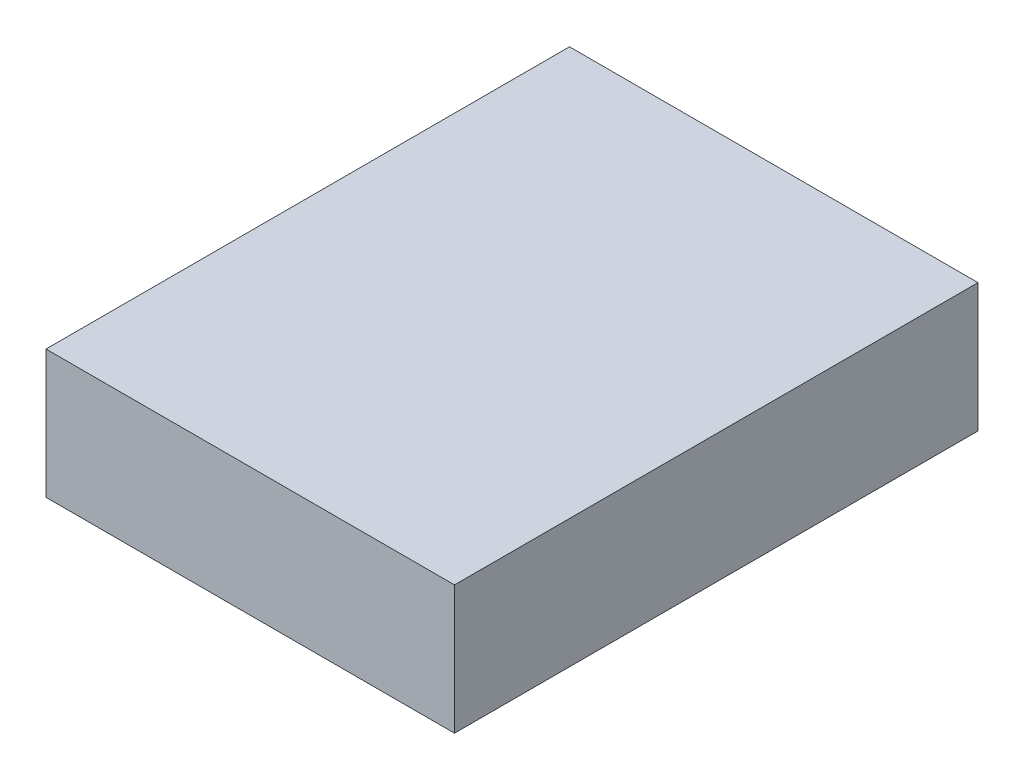
ISO-10303-21;
HEADER;
FILE_DESCRIPTION(('STEP AP214'),'2;1');
FILE_NAME('part.step','',(''),(''),'','','');
FILE_SCHEMA(('AUTOMOTIVE_DESIGN { 1 0 10303 214 1 1 1 1 }'));
ENDSEC;
DATA;
#1=APPLICATION_CONTEXT('core data for automotive mechanical design processes');
#2=APPLICATION_PROTOCOL_DEFINITION('international standard','automotive_design',2000,#1);
#3=PRODUCT_CONTEXT('',#1,'mechanical');
#4=PRODUCT('Part','Part','',(#3));
#5=PRODUCT_RELATED_PRODUCT_CATEGORY('part','',(#4));
#6=PRODUCT_DEFINITION_FORMATION('','',#4);
#7=PRODUCT_DEFINITION_CONTEXT('part definition',#1,'design');
#8=PRODUCT_DEFINITION('design','',#6,#7);
#9=PRODUCT_DEFINITION_SHAPE('','',#8);
#10=(LENGTH_UNIT() NAMED_UNIT(*) SI_UNIT(.MILLI.,.METRE.));
#11=(NAMED_UNIT(*) PLANE_ANGLE_UNIT() SI_UNIT($,.RADIAN.));
#12=(NAMED_UNIT(*) SI_UNIT($,.STERADIAN.) SOLID_ANGLE_UNIT());
#13=UNCERTAINTY_MEASURE_WITH_UNIT(LENGTH_MEASURE(1.E-05),#10,'distance_accuracy_value','');
#14=(GEOMETRIC_REPRESENTATION_CONTEXT(3) GLOBAL_UNCERTAINTY_ASSIGNED_CONTEXT((#13)) GLOBAL_UNIT_ASSIGNED_CONTEXT((#10,
#11,#12)) REPRESENTATION_CONTEXT('',''));
#15=CARTESIAN_POINT('',(0.,0.,0.));
#16=DIRECTION('',(0.,0.,1.));
#17=DIRECTION('',(1.,0.,0.));
#18=AXIS2_PLACEMENT_3D('',#15,#16,#17);
#19=CARTESIAN_POINT('',(31.8,20.,-40.75));
#20=DIRECTION('',(-1.,0.,0.));
#21=DIRECTION('',(0.,0.,1.));
#22=AXIS2_PLACEMENT_3D('',#19,#20,#21);
#23=PLANE('',#22);
#24=DIRECTION('',(0.,0.,-1.));
#25=VECTOR('',#24,1.);
#26=CARTESIAN_POINT('',(31.8,0.,-40.75));
#27=LINE('',#26,#25);
#28=CARTESIAN_POINT('',(31.8,0.,40.75));
#29=VERTEX_POINT('',#28);
#30=CARTESIAN_POINT('',(31.8,0.,-40.75));
#31=VERTEX_POINT('',#30);
#32=EDGE_CURVE('E111',#29,#31,#27,.T.);
#33=ORIENTED_EDGE('',*,*,#32,.T.);
#34=DIRECTION('',(0.,-1.,0.));
#35=VECTOR('',#34,1.);
#36=CARTESIAN_POINT('',(31.8,20.,-40.75));
#37=LINE('',#36,#35);
#38=CARTESIAN_POINT('',(31.8,20.,-40.75));
#39=VERTEX_POINT('',#38);
#40=EDGE_CURVE('E11',#39,#31,#37,.T.);
#41=ORIENTED_EDGE('',*,*,#40,.F.);
#42=DIRECTION('',(0.,0.,-1.));
#43=VECTOR('',#42,1.);
#44=CARTESIAN_POINT('',(31.8,20.,-40.75));
#45=LINE('',#44,#43);
#46=CARTESIAN_POINT('',(31.8,20.,40.75));
#47=VERTEX_POINT('',#46);
#48=EDGE_CURVE('E99',#47,#39,#45,.T.);
#49=ORIENTED_EDGE('',*,*,#48,.F.);
#50=DIRECTION('',(0.,-1.,0.));
#51=VECTOR('',#50,1.);
#52=CARTESIAN_POINT('',(31.8,20.,40.75));
#53=LINE('',#52,#51);
#54=EDGE_CURVE('E107',#47,#29,#53,.T.);
#55=ORIENTED_EDGE('',*,*,#54,.T.);
#56=EDGE_LOOP('',(#33,#41,#49,#55));
#57=FACE_BOUND('',#56,.T.);
#58=ADVANCED_FACE('F48',(#57),#23,.F.);
#59=CARTESIAN_POINT('',(-31.8,20.,-40.75));
#60=DIRECTION('',(0.,0.,1.));
#61=DIRECTION('',(1.,0.,0.));
#62=AXIS2_PLACEMENT_3D('',#59,#60,#61);
#63=PLANE('',#62);
#64=DIRECTION('',(-1.,0.,0.));
#65=VECTOR('',#64,1.);
#66=CARTESIAN_POINT('',(-31.8,0.,-40.75));
#67=LINE('',#66,#65);
#68=CARTESIAN_POINT('',(-31.8,0.,-40.75));
#69=VERTEX_POINT('',#68);
#70=EDGE_CURVE('E103',#31,#69,#67,.T.);
#71=ORIENTED_EDGE('',*,*,#70,.T.);
#72=DIRECTION('',(0.,-1.,0.));
#73=VECTOR('',#72,1.);
#74=CARTESIAN_POINT('',(-31.8,20.,-40.75));
#75=LINE('',#74,#73);
#76=CARTESIAN_POINT('',(-31.8,20.,-40.75));
#77=VERTEX_POINT('',#76);
#78=EDGE_CURVE('E56',#77,#69,#75,.T.);
#79=ORIENTED_EDGE('',*,*,#78,.F.);
#80=DIRECTION('',(-1.,0.,0.));
#81=VECTOR('',#80,1.);
#82=CARTESIAN_POINT('',(-31.8,20.,-40.75));
#83=LINE('',#82,#81);
#84=EDGE_CURVE('E94',#39,#77,#83,.T.);
#85=ORIENTED_EDGE('',*,*,#84,.F.);
#86=ORIENTED_EDGE('',*,*,#40,.T.);
#87=EDGE_LOOP('',(#71,#79,#85,#86));
#88=FACE_BOUND('',#87,.T.);
#89=ADVANCED_FACE('F102',(#88),#63,.F.);
#90=CARTESIAN_POINT('',(-31.8,20.,-40.75));
#91=DIRECTION('',(1.,0.,0.));
#92=DIRECTION('',(0.,0.,-1.));
#93=AXIS2_PLACEMENT_3D('',#90,#91,#92);
#94=PLANE('',#93);
#95=DIRECTION('',(0.,0.,1.));
#96=VECTOR('',#95,1.);
#97=CARTESIAN_POINT('',(-31.8,0.,-40.75));
#98=LINE('',#97,#96);
#99=CARTESIAN_POINT('',(-31.8,0.,40.75));
#100=VERTEX_POINT('',#99);
#101=EDGE_CURVE('E81',#69,#100,#98,.T.);
#102=ORIENTED_EDGE('',*,*,#101,.T.);
#103=DIRECTION('',(0.,-1.,0.));
#104=VECTOR('',#103,1.);
#105=CARTESIAN_POINT('',(-31.8,20.,40.75));
#106=LINE('',#105,#104);
#107=CARTESIAN_POINT('',(-31.8,20.,40.75));
#108=VERTEX_POINT('',#107);
#109=EDGE_CURVE('E104',#108,#100,#106,.T.);
#110=ORIENTED_EDGE('',*,*,#109,.F.);
#111=DIRECTION('',(0.,0.,1.));
#112=VECTOR('',#111,1.);
#113=CARTESIAN_POINT('',(-31.8,20.,-40.75));
#114=LINE('',#113,#112);
#115=EDGE_CURVE('E97',#77,#108,#114,.T.);
#116=ORIENTED_EDGE('',*,*,#115,.F.);
#117=ORIENTED_EDGE('',*,*,#78,.T.);
#118=EDGE_LOOP('',(#102,#110,#116,#117));
#119=FACE_BOUND('',#118,.T.);
#120=ADVANCED_FACE('F105',(#119),#94,.F.);
#121=CARTESIAN_POINT('',(-31.8,20.,40.75));
#122=DIRECTION('',(0.,0.,-1.));
#123=DIRECTION('',(-1.,0.,0.));
#124=AXIS2_PLACEMENT_3D('',#121,#122,#123);
#125=PLANE('',#124);
#126=DIRECTION('',(1.,0.,0.));
#127=VECTOR('',#126,1.);
#128=CARTESIAN_POINT('',(-31.8,0.,40.75));
#129=LINE('',#128,#127);
#130=EDGE_CURVE('E87',#100,#29,#129,.T.);
#131=ORIENTED_EDGE('',*,*,#130,.T.);
#132=ORIENTED_EDGE('',*,*,#54,.F.);
#133=DIRECTION('',(1.,0.,0.));
#134=VECTOR('',#133,1.);
#135=CARTESIAN_POINT('',(-31.8,20.,40.75));
#136=LINE('',#135,#134);
#137=EDGE_CURVE('E64',#108,#47,#136,.T.);
#138=ORIENTED_EDGE('',*,*,#137,.F.);
#139=ORIENTED_EDGE('',*,*,#109,.T.);
#140=EDGE_LOOP('',(#131,#132,#138,#139));
#141=FACE_BOUND('',#140,.T.);
#142=ADVANCED_FACE('F118',(#141),#125,.F.);
#143=CARTESIAN_POINT('',(0.,20.,0.));
#144=DIRECTION('',(0.,1.,0.));
#145=DIRECTION('',(0.,0.,1.));
#146=AXIS2_PLACEMENT_3D('',#143,#144,#145);
#147=PLANE('',#146);
#148=ORIENTED_EDGE('',*,*,#48,.T.);
#149=ORIENTED_EDGE('',*,*,#84,.T.);
#150=ORIENTED_EDGE('',*,*,#115,.T.);
#151=ORIENTED_EDGE('',*,*,#137,.T.);
#152=EDGE_LOOP('',(#148,#149,#150,#151));
#153=FACE_BOUND('',#152,.T.);
#154=ADVANCED_FACE('F95',(#153),#147,.T.);
#155=CARTESIAN_POINT('',(0.,0.,0.));
#156=DIRECTION('',(0.,1.,0.));
#157=DIRECTION('',(0.,0.,1.));
#158=AXIS2_PLACEMENT_3D('',#155,#156,#157);
#159=PLANE('',#158);
#160=ORIENTED_EDGE('',*,*,#32,.F.);
#161=ORIENTED_EDGE('',*,*,#130,.F.);
#162=ORIENTED_EDGE('',*,*,#101,.F.);
#163=ORIENTED_EDGE('',*,*,#70,.F.);
#164=EDGE_LOOP('',(#160,#161,#162,#163));
#165=FACE_BOUND('',#164,.T.);
#166=ADVANCED_FACE('F121',(#165),#159,.F.);
#167=CLOSED_SHELL('',(#58,#89,#120,#142,#154,#166));
#168=MANIFOLD_SOLID_BREP('B2',#167);
#169=ADVANCED_BREP_SHAPE_REPRESENTATION('',(#18,#168),#14);
#170=SHAPE_DEFINITION_REPRESENTATION(#9,#169);
ENDSEC;
END-ISO-10303-21;
